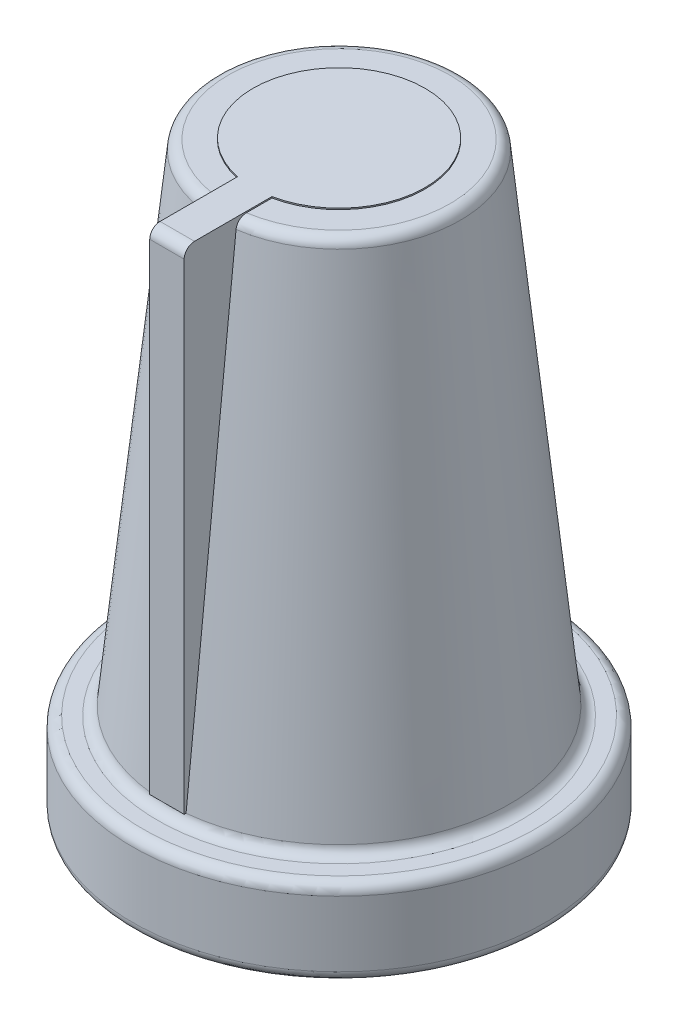
ISO-10303-21;
HEADER;
FILE_DESCRIPTION(('STEP AP214'),'2;1');
FILE_NAME('part.step','',(''),(''),'','','');
FILE_SCHEMA(('AUTOMOTIVE_DESIGN { 1 0 10303 214 1 1 1 1 }'));
ENDSEC;
DATA;
#1=APPLICATION_CONTEXT('core data for automotive mechanical design processes');
#2=APPLICATION_PROTOCOL_DEFINITION('international standard','automotive_design',2000,#1);
#3=PRODUCT_CONTEXT('',#1,'mechanical');
#4=PRODUCT('Part','Part','',(#3));
#5=PRODUCT_RELATED_PRODUCT_CATEGORY('part','',(#4));
#6=PRODUCT_DEFINITION_FORMATION('','',#4);
#7=PRODUCT_DEFINITION_CONTEXT('part definition',#1,'design');
#8=PRODUCT_DEFINITION('design','',#6,#7);
#9=PRODUCT_DEFINITION_SHAPE('','',#8);
#10=(LENGTH_UNIT() NAMED_UNIT(*) SI_UNIT(.MILLI.,.METRE.));
#11=(NAMED_UNIT(*) PLANE_ANGLE_UNIT() SI_UNIT($,.RADIAN.));
#12=(NAMED_UNIT(*) SI_UNIT($,.STERADIAN.) SOLID_ANGLE_UNIT());
#13=UNCERTAINTY_MEASURE_WITH_UNIT(LENGTH_MEASURE(1.E-05),#10,'distance_accuracy_value','');
#14=(GEOMETRIC_REPRESENTATION_CONTEXT(3) GLOBAL_UNCERTAINTY_ASSIGNED_CONTEXT((#13)) GLOBAL_UNIT_ASSIGNED_CONTEXT((#10,
#11,#12)) REPRESENTATION_CONTEXT('',''));
#15=CARTESIAN_POINT('',(0.,0.,0.));
#16=DIRECTION('',(0.,0.,1.));
#17=DIRECTION('',(1.,0.,0.));
#18=AXIS2_PLACEMENT_3D('',#15,#16,#17);
#19=CARTESIAN_POINT('',(0.,10.,0.));
#20=DIRECTION('',(0.,-1.,0.));
#21=DIRECTION('',(0.,0.,-1.));
#22=AXIS2_PLACEMENT_3D('',#19,#20,#21);
#23=PLANE('',#22);
#24=DIRECTION('',(0.,0.,1.));
#25=VECTOR('',#24,1.);
#26=CARTESIAN_POINT('',(-3.,10.,0.));
#27=LINE('',#26,#25);
#28=CARTESIAN_POINT('',(-3.,10.,2.44948974278318));
#29=VERTEX_POINT('',#28);
#30=CARTESIAN_POINT('',(-3.,10.,3.19044893302208));
#31=VERTEX_POINT('',#30);
#32=EDGE_CURVE('E45',#29,#31,#27,.T.);
#33=ORIENTED_EDGE('',*,*,#32,.F.);
#34=CARTESIAN_POINT('',(-2.5,10.,0.));
#35=DIRECTION('',(0.,-1.,0.));
#36=DIRECTION('',(0.,0.,-1.));
#37=AXIS2_PLACEMENT_3D('',#34,#35,#36);
#38=CIRCLE('',#37,2.5);
#39=CARTESIAN_POINT('',(-2.,10.,2.44948974278318));
#40=VERTEX_POINT('',#39);
#41=EDGE_CURVE('E229',#29,#40,#38,.T.);
#42=ORIENTED_EDGE('',*,*,#41,.T.);
#43=DIRECTION('',(0.,0.,-1.));
#44=VECTOR('',#43,1.);
#45=CARTESIAN_POINT('',(-2.,10.,0.));
#46=LINE('',#45,#44);
#47=CARTESIAN_POINT('',(-2.,10.,3.19044893302208));
#48=VERTEX_POINT('',#47);
#49=EDGE_CURVE('E123',#48,#40,#46,.T.);
#50=ORIENTED_EDGE('',*,*,#49,.F.);
#51=CARTESIAN_POINT('',(-2.5,10.,0.));
#52=DIRECTION('',(0.,-1.,0.));
#53=DIRECTION('',(0.,0.,-1.));
#54=AXIS2_PLACEMENT_3D('',#51,#52,#53);
#55=CIRCLE('',#54,3.22939071563379);
#56=EDGE_CURVE('E165',#31,#48,#55,.T.);
#57=ORIENTED_EDGE('',*,*,#56,.F.);
#58=EDGE_LOOP('',(#33,#42,#50,#57));
#59=FACE_BOUND('',#58,.T.);
#60=ADVANCED_FACE('F36',(#59),#23,.F.);
#61=CARTESIAN_POINT('',(-2.5,9.7,0.));
#62=DIRECTION('',(0.,-1.,0.));
#63=DIRECTION('',(0.,0.,-1.));
#64=AXIS2_PLACEMENT_3D('',#61,#62,#63);
#65=TOROIDAL_SURFACE('',#64,3.2293907156338,0.3);
#66=CARTESIAN_POINT('',(-2.,9.80659714473536,2.90627092595592));
#67=CARTESIAN_POINT('',(-2.,9.79107954288905,2.9002863500572));
#68=CARTESIAN_POINT('',(-2.,9.77504808297474,2.89560237405859));
#69=CARTESIAN_POINT('',(-2.,9.74241386718379,2.88898893072874));
#70=CARTESIAN_POINT('',(-2.,9.72581051198507,2.88706244899287));
#71=CARTESIAN_POINT('',(-2.,9.69252055488031,2.88603047368517));
#72=CARTESIAN_POINT('',(-2.,9.67583398345656,2.88692401347683));
#73=CARTESIAN_POINT('',(-2.,9.64285274548175,2.89150241449114));
#74=CARTESIAN_POINT('',(-2.,9.62655799367985,2.89518666274562));
#75=CARTESIAN_POINT('',(-2.,9.59482463577489,2.90522871580636));
#76=CARTESIAN_POINT('',(-2.,9.57938557263475,2.91158507751015));
#77=CARTESIAN_POINT('',(-2.,9.54978074876005,2.926778759478));
#78=CARTESIAN_POINT('',(-2.,9.53561507364576,2.93561624640388));
#79=CARTESIAN_POINT('',(-2.,9.50882792360195,2.95559534741943));
#80=CARTESIAN_POINT('',(-2.,9.49622046827976,2.96675575160609));
#81=CARTESIAN_POINT('',(-2.,9.47302727100841,2.99100940783063));
#82=CARTESIAN_POINT('',(-2.,9.46244166507938,3.00410278980479));
#83=CARTESIAN_POINT('',(-2.,9.44344148390248,3.03203960938277));
#84=CARTESIAN_POINT('',(-2.,9.43505808413229,3.04690425083685));
#85=CARTESIAN_POINT('',(-2.,9.42087264251779,3.07781802599083));
#86=CARTESIAN_POINT('',(-2.,9.41507076947824,3.09386723706917));
#87=CARTESIAN_POINT('',(-2.,9.40614892346205,3.12689460678346));
#88=CARTESIAN_POINT('',(-2.,9.40306077391086,3.14388136831635));
#89=CARTESIAN_POINT('',(-2.,9.399765434898,3.17813240423763));
#90=CARTESIAN_POINT('',(-2.,9.3995583514594,3.19539668881544));
#91=CARTESIAN_POINT('',(-2.,9.40203989339294,3.22979635514038));
#92=CARTESIAN_POINT('',(-2.,9.4047418343585,3.24693077952062));
#93=CARTESIAN_POINT('',(-2.,9.41299399579652,3.28049990997672));
#94=CARTESIAN_POINT('',(-2.,9.41854419166324,3.29693462209599));
#95=CARTESIAN_POINT('',(-2.,9.43232129625537,3.32857287008354));
#96=CARTESIAN_POINT('',(-2.,9.44053874037676,3.34378052529881));
#97=CARTESIAN_POINT('',(-2.,9.459432643321,3.37258326450878));
#98=CARTESIAN_POINT('',(-2.,9.47010899304404,3.38617842000837));
#99=CARTESIAN_POINT('',(-2.,9.49351485433732,3.41123528721718));
#100=CARTESIAN_POINT('',(-2.,9.50622466753077,3.42271539688204));
#101=CARTESIAN_POINT('',(-2.,9.53340897683371,3.44335128650953));
#102=CARTESIAN_POINT('',(-2.,9.54788336869423,3.45250720368397));
#103=CARTESIAN_POINT('',(-2.,9.57802081359236,3.4681333682114));
#104=CARTESIAN_POINT('',(-2.,9.593669647033,3.47463104398561));
#105=CARTESIAN_POINT('',(-2.,9.62584151559273,3.48488289790701));
#106=CARTESIAN_POINT('',(-2.,9.64236450704172,3.48863721296509));
#107=CARTESIAN_POINT('',(-2.,9.67567387985522,3.49326966184609));
#108=CARTESIAN_POINT('',(-2.,9.69245710183501,3.49417053705435));
#109=CARTESIAN_POINT('',(-2.,9.72593532717118,3.49313328349119));
#110=CARTESIAN_POINT('',(-2.,9.74263033266934,3.49119522396557));
#111=CARTESIAN_POINT('',(-2.,9.7754112661128,3.48454766553607));
#112=CARTESIAN_POINT('',(-2.,9.79149872934324,3.47984573061657));
#113=CARTESIAN_POINT('',(-2.,9.82265974772867,3.46781646283782));
#114=CARTESIAN_POINT('',(-2.,9.8377332944407,3.46048910811973));
#115=CARTESIAN_POINT('',(-2.,9.86649561601724,3.44339589312583));
#116=CARTESIAN_POINT('',(-2.,9.88017959494747,3.43362196573282));
#117=CARTESIAN_POINT('',(-2.,9.90572947731311,3.41193303384462));
#118=CARTESIAN_POINT('',(-2.,9.91759531552992,3.4000179525773));
#119=CARTESIAN_POINT('',(-2.,9.93927987615705,3.37428097965713));
#120=CARTESIAN_POINT('',(-2.,9.94908074291233,3.36044404640472));
#121=CARTESIAN_POINT('',(-2.,9.9662487250114,3.33133504911752));
#122=CARTESIAN_POINT('',(-2.,9.97361570249089,3.31606290385005));
#123=CARTESIAN_POINT('',(-2.,9.98578852012221,3.28434459789789));
#124=CARTESIAN_POINT('',(-2.,9.99056650820758,3.26788774738349));
#125=CARTESIAN_POINT('',(-2.,9.99731891533104,3.23440852110048));
#126=CARTESIAN_POINT('',(-2.,9.99929317712394,3.21738611366776));
#127=CARTESIAN_POINT('',(-2.,10.0003947367035,3.18309736472043));
#128=CARTESIAN_POINT('',(-2.,9.99949654231611,3.16583020049259));
#129=CARTESIAN_POINT('',(-2.,9.9948240133196,3.1316897420605));
#130=CARTESIAN_POINT('',(-2.,9.9910496984481,3.11481644515414));
#131=CARTESIAN_POINT('',(-2.,9.98071118401219,3.08189037567392));
#132=CARTESIAN_POINT('',(-2.,9.97413854373954,3.06584025154189));
#133=CARTESIAN_POINT('',(-2.,9.95837684613505,3.03507445613103));
#134=CARTESIAN_POINT('',(-2.,9.94918717612934,3.02035909839979));
#135=CARTESIAN_POINT('',(-2.,9.9284924151483,2.99276469536177));
#136=CARTESIAN_POINT('',(-2.,9.91699808675214,2.97987757311063));
#137=CARTESIAN_POINT('',(-2.,9.89199352423432,2.95625768389604));
#138=CARTESIAN_POINT('',(-2.,9.87848588129159,2.94552218878304));
#139=CARTESIAN_POINT('',(-2.,9.85514884979056,2.93004266787893));
#140=CARTESIAN_POINT('',(-2.,9.84580633992835,2.9245510665485));
#141=CARTESIAN_POINT('',(-2.,9.82658083907848,2.91461293714097));
#142=CARTESIAN_POINT('',(-2.,9.81669785170365,2.91016640207918));
#143=CARTESIAN_POINT('',(-2.,9.80659714473536,2.90627092595592));
#144=B_SPLINE_CURVE_WITH_KNOTS('',3,(#66,#67,#68,#69,#70,#71,#72,#73,#74,#75,#76,#77,#78,#79,
#80,#81,#82,#83,#84,#85,#86,#87,#88,#89,#90,#91,#92,#93,#94,#95,#96,#97,#98,#99,#100,#101,#102,
#103,#104,#105,#106,#107,#108,#109,#110,#111,#112,#113,#114,#115,#116,#117,#118,#119,#120,#121,
#122,#123,#124,#125,#126,#127,#128,#129,#130,#131,#132,#133,#134,#135,#136,#137,#138,#139,#140,
#141,#142,#143),.UNSPECIFIED.,.T.,.F.,(4,2,2,2,2,2,2,2,2,2,2,2,2,2,2,2,2,2,2,2,2,2,2,2,2,2,2,2,
2,2,2,2,2,2,2,2,2,2,4),(0.,0.0498556318695391,0.0997652027243041,0.14965766762013,
0.199539177008407,0.249393781910329,0.299251736440633,0.349529862590244,0.399811370015246,
0.450770395190202,0.501732752061171,0.553285054195704,0.604839253446782,0.656630441015106,
0.708421181172938,0.760030117468943,0.811636764355758,0.862770795133005,0.913901806442036,
0.964491053124979,1.01507777491514,1.06526030209604,1.1154416052715,1.16548621091952,
1.21553123324103,1.26574349493911,1.31595755738157,1.36658945160017,1.41722421330086,
1.46839339735515,1.51956545108728,1.57119289726902,1.62281998915603,1.67460392178552,
1.72639998755232,1.7779595788735,1.82945337591021,1.86190558721202,1.89435758161301),.UNSPECIFIED.);
#145=CARTESIAN_POINT('',(-2.,9.73082278703105,3.49219053996464));
#146=VERTEX_POINT('',#145);
#147=EDGE_CURVE('E142',#146,#48,#144,.T.);
#148=ORIENTED_EDGE('',*,*,#147,.F.);
#149=CARTESIAN_POINT('',(-2.5,9.73082278703105,0.));
#150=DIRECTION('',(0.,-1.,0.));
#151=DIRECTION('',(0.,0.,-1.));
#152=AXIS2_PLACEMENT_3D('',#149,#150,#151);
#153=CIRCLE('',#152,3.52780310780215);
#154=CARTESIAN_POINT('',(-3.,9.73082278703105,3.49219053996464));
#155=VERTEX_POINT('',#154);
#156=EDGE_CURVE('E240',#155,#146,#153,.T.);
#157=ORIENTED_EDGE('',*,*,#156,.F.);
#158=CARTESIAN_POINT('',(-3.,9.80659714473536,2.90627092595592));
#159=CARTESIAN_POINT('',(-3.,9.82233910592254,2.91234369296216));
#160=CARTESIAN_POINT('',(-3.,9.83757528962061,2.9197641034663));
#161=CARTESIAN_POINT('',(-3.,9.8665919492256,2.93707340003797));
#162=CARTESIAN_POINT('',(-3.,9.8803704524328,2.94696557185542));
#163=CARTESIAN_POINT('',(-3.,9.90606353704512,2.96890605100413));
#164=CARTESIAN_POINT('',(-3.,9.91798007319742,2.98095206827678));
#165=CARTESIAN_POINT('',(-3.,9.93964252159488,3.00685216511195));
#166=CARTESIAN_POINT('',(-3.,9.94938894958684,3.02070581382973));
#167=CARTESIAN_POINT('',(-3.,9.96654697818114,3.04997944114713));
#168=CARTESIAN_POINT('',(-3.,9.973933974619,3.06541384078252));
#169=CARTESIAN_POINT('',(-3.,9.98604318243197,3.09729562562512));
#170=CARTESIAN_POINT('',(-3.,9.9907651218682,3.11374311401671));
#171=CARTESIAN_POINT('',(-3.,9.99745399402902,3.14736876078178));
#172=CARTESIAN_POINT('',(-3.,9.99939156144716,3.16455276665542));
#173=CARTESIAN_POINT('',(-3.,10.0003637901154,3.19900304469745));
#174=CARTESIAN_POINT('',(-3.,9.99939837527602,3.21626931901031));
#175=CARTESIAN_POINT('',(-3.,9.99457939984763,3.25044614938137));
#176=CARTESIAN_POINT('',(-3.,9.99071741327966,3.26735551939245));
#177=CARTESIAN_POINT('',(-3.,9.98019549157291,3.30028055448737));
#178=CARTESIAN_POINT('',(-3.,9.97353560984408,3.31629623662451));
#179=CARTESIAN_POINT('',(-3.,9.95763627655503,3.34689153883284));
#180=CARTESIAN_POINT('',(-3.,9.9484097141939,3.36147785428725));
#181=CARTESIAN_POINT('',(-3.,9.92761592659742,3.38887443343399));
#182=CARTESIAN_POINT('',(-3.,9.91604881410048,3.40168478262011));
#183=CARTESIAN_POINT('',(-3.,9.89102266589646,3.42503032748729));
#184=CARTESIAN_POINT('',(-3.,9.87758329479071,3.43558660164077));
#185=CARTESIAN_POINT('',(-3.,9.8491076606696,3.45426491937455));
#186=CARTESIAN_POINT('',(-3.,9.83407149256587,3.46238710752434));
#187=CARTESIAN_POINT('',(-3.,9.80299700441807,3.47587987057707));
#188=CARTESIAN_POINT('',(-3.,9.78697068481448,3.48127808893759));
#189=CARTESIAN_POINT('',(-3.,9.75423592312133,3.48928568272434));
#190=CARTESIAN_POINT('',(-3.,9.73752751220781,3.49189518546532));
#191=CARTESIAN_POINT('',(-3.,9.70402966503821,3.49423790772078));
#192=CARTESIAN_POINT('',(-3.,9.6872416418114,3.49399137693554));
#193=CARTESIAN_POINT('',(-3.,9.65394645872922,3.49067851091755));
#194=CARTESIAN_POINT('',(-3.,9.63743929382066,3.48761222647229));
#195=CARTESIAN_POINT('',(-3.,9.60519881958515,3.47875854586465));
#196=CARTESIAN_POINT('',(-3.,9.58946438437197,3.47297524672809));
#197=CARTESIAN_POINT('',(-3.,9.55918368568942,3.45886057381043));
#198=CARTESIAN_POINT('',(-3.,9.54463743927583,3.45052916346081));
#199=CARTESIAN_POINT('',(-3.,9.51707298846111,3.43151925896952));
#200=CARTESIAN_POINT('',(-3.,9.50406193969162,3.42083039237099));
#201=CARTESIAN_POINT('',(-3.,9.47999914199693,3.39743777694235));
#202=CARTESIAN_POINT('',(-3.,9.46894747445966,3.38473394445697));
#203=CARTESIAN_POINT('',(-3.,9.44900866906952,3.35755071192744));
#204=CARTESIAN_POINT('',(-3.,9.44014200128571,3.34305629921728));
#205=CARTESIAN_POINT('',(-3.,9.42493853306359,3.31279660290074));
#206=CARTESIAN_POINT('',(-3.,9.41860187622881,3.2970312472166));
#207=CARTESIAN_POINT('',(-3.,9.40856909562181,3.26449898683008));
#208=CARTESIAN_POINT('',(-3.,9.40490155563889,3.24772326547568));
#209=CARTESIAN_POINT('',(-3.,9.40041010840627,3.21379527810764));
#210=CARTESIAN_POINT('',(-3.,9.39958634517178,3.19664299306823));
#211=CARTESIAN_POINT('',(-3.,9.40080570655277,3.16230224712349));
#212=CARTESIAN_POINT('',(-3.,9.4028719025548,3.1451146014848));
#213=CARTESIAN_POINT('',(-3.,9.4098552416673,3.11132806172925));
#214=CARTESIAN_POINT('',(-3.,9.41477245813387,3.09472918277289));
#215=CARTESIAN_POINT('',(-3.,9.42733573706,3.06256703011727));
#216=CARTESIAN_POINT('',(-3.,9.4349861448151,3.04700545256113));
#217=CARTESIAN_POINT('',(-3.,9.45280768187299,3.01739888179029));
#218=CARTESIAN_POINT('',(-3.,9.46297875424321,3.00335385433257));
#219=CARTESIAN_POINT('',(-3.,9.48548647135191,2.97728515479003));
#220=CARTESIAN_POINT('',(-3.,9.49780820349624,2.96524861258032));
#221=CARTESIAN_POINT('',(-3.,9.5243200652411,2.94344810448748));
#222=CARTESIAN_POINT('',(-3.,9.53850998905355,2.93368388862676));
#223=CARTESIAN_POINT('',(-3.,9.56815956046341,2.91684107415682));
#224=CARTESIAN_POINT('',(-3.,9.58360036151502,2.90972929872689));
#225=CARTESIAN_POINT('',(-3.,9.61547151706778,2.89823577316051));
#226=CARTESIAN_POINT('',(-3.,9.63190204436552,2.89385450126732));
#227=CARTESIAN_POINT('',(-3.,9.66506239129601,2.88799980563571));
#228=CARTESIAN_POINT('',(-3.,9.68178603298571,2.88649123494713));
#229=CARTESIAN_POINT('',(-3.,9.71523294720304,2.88632494264542));
#230=CARTESIAN_POINT('',(-3.,9.73195619260783,2.88766356133625));
#231=CARTESIAN_POINT('',(-3.,9.75836728426786,2.89204708680595));
#232=CARTESIAN_POINT('',(-3.,9.76821118912431,2.89420305982011));
#233=CARTESIAN_POINT('',(-3.,9.78762914579854,2.89950303605228));
#234=CARTESIAN_POINT('',(-3.,9.79720320026133,2.90264702958228));
#235=CARTESIAN_POINT('',(-3.,9.80659714473536,2.90627092595592));
#236=B_SPLINE_CURVE_WITH_KNOTS('',3,(#158,#159,#160,#161,#162,#163,#164,#165,#166,#167,#168,
#169,#170,#171,#172,#173,#174,#175,#176,#177,#178,#179,#180,#181,#182,#183,#184,#185,#186,#187,
#188,#189,#190,#191,#192,#193,#194,#195,#196,#197,#198,#199,#200,#201,#202,#203,#204,#205,#206,
#207,#208,#209,#210,#211,#212,#213,#214,#215,#216,#217,#218,#219,#220,#221,#222,#223,#224,#225,
#226,#227,#228,#229,#230,#231,#232,#233,#234,#235),.UNSPECIFIED.,.T.,.F.,(4,2,2,2,2,2,2,2,2,2,2,
2,2,2,2,2,2,2,2,2,2,2,2,2,2,2,2,2,2,2,2,2,2,2,2,2,2,2,4),(0.,0.0505807108587324,
0.101229020501536,0.151823795547677,0.202406533400379,0.253500719803999,0.304600118848522,
0.356234578072008,0.407870390687967,0.459656994653379,0.511442610091828,0.562972725658993,
0.614500359740451,0.665522710531416,0.716542030312917,0.767032622156604,0.817520908827177,
0.867651446450065,0.917781081173392,0.967835366132328,1.01789036946525,1.06817016410037,
1.11845204674679,1.16918846827102,1.21992776918733,1.27120275160075,1.32248033065579,
1.37416961810945,1.42586023557571,1.47763340046989,1.52940539610438,1.5808317187318,
1.63225238129552,1.6830063945854,1.73376929486168,1.78390702716896,1.83398035281364,
1.86416446028389,1.89434827179339),.UNSPECIFIED.);
#237=EDGE_CURVE('E136',#31,#155,#236,.T.);
#238=ORIENTED_EDGE('',*,*,#237,.F.);
#239=ORIENTED_EDGE('',*,*,#56,.T.);
#240=EDGE_LOOP('',(#148,#157,#238,#239));
#241=FACE_BOUND('',#240,.T.);
#242=ADVANCED_FACE('F38',(#241),#65,.T.);
#243=CARTESIAN_POINT('',(-2.5,-7.,0.));
#244=DIRECTION('',(0.,-1.,0.));
#245=DIRECTION('',(0.,0.,-1.));
#246=AXIS2_PLACEMENT_3D('',#243,#244,#245);
#247=CYLINDRICAL_SURFACE('',#246,3.);
#248=CARTESIAN_POINT('',(-2.5,-5.,0.));
#249=DIRECTION('',(0.,-1.,0.));
#250=DIRECTION('',(0.,0.,-1.));
#251=AXIS2_PLACEMENT_3D('',#248,#249,#250);
#252=CIRCLE('',#251,3.);
#253=CARTESIAN_POINT('',(-2.5,-5.,-3.));
#254=VERTEX_POINT('',#253);
#255=EDGE_CURVE('E270',#254,#254,#252,.T.);
#256=ORIENTED_EDGE('',*,*,#255,.T.);
#257=EDGE_LOOP('',(#256));
#258=FACE_BOUND('',#257,.T.);
#259=CARTESIAN_POINT('',(-2.5,8.93754676912061,0.));
#260=DIRECTION('',(0.,1.,0.));
#261=DIRECTION('',(0.,0.,1.));
#262=AXIS2_PLACEMENT_3D('',#259,#260,#261);
#263=CIRCLE('',#262,3.);
#264=CARTESIAN_POINT('',(-2.5,8.93754676912061,3.));
#265=VERTEX_POINT('',#264);
#266=EDGE_CURVE('E116',#265,#265,#263,.F.);
#267=ORIENTED_EDGE('',*,*,#266,.F.);
#268=EDGE_LOOP('',(#267));
#269=FACE_BOUND('',#268,.T.);
#270=ADVANCED_FACE('F176',(#258,#269),#247,.F.);
#271=CARTESIAN_POINT('',(-2.5,9.73082278703105,0.));
#272=DIRECTION('',(0.,-1.,0.));
#273=DIRECTION('',(0.,0.,-1.));
#274=AXIS2_PLACEMENT_3D('',#271,#272,#273);
#275=CONICAL_SURFACE('',#274,3.52780310780215,0.102924246839153);
#276=CARTESIAN_POINT('',(-2.,-10.99927987243,5.6469067110615));
#277=CARTESIAN_POINT('',(-2.,-9.56252525721492,5.49792288587475));
#278=CARTESIAN_POINT('',(-2.,-8.12577496863599,5.34889730224219));
#279=CARTESIAN_POINT('',(-2.,-5.25228594525633,5.05072897545301));
#280=CARTESIAN_POINT('',(-2.,-3.81554721046065,4.90158623224771));
#281=CARTESIAN_POINT('',(-2.,-1.66045081683063,4.67775910576684));
#282=CARTESIAN_POINT('',(-2.,-0.942087289629983,4.60313122686343));
#283=CARTESIAN_POINT('',(-2.,0.494635119735027,4.45383150926873));
#284=CARTESIAN_POINT('',(-2.,1.21299400189987,4.37915967058211));
#285=CARTESIAN_POINT('',(-2.,2.64970609301175,4.22976499499284));
#286=CARTESIAN_POINT('',(-2.,3.3680593019615,4.15504215811625));
#287=CARTESIAN_POINT('',(-2.,4.80475974427069,4.00553642211661));
#288=CARTESIAN_POINT('',(-2.,5.52310697762777,3.93075352297087));
#289=CARTESIAN_POINT('',(-2.,7.45244702284827,3.72980531440301));
#290=CARTESIAN_POINT('',(-2.,8.66343305356435,3.60357488545938));
#291=CARTESIAN_POINT('',(-2.,11.0853762814993,3.35084149790562));
#292=CARTESIAN_POINT('',(-2.,12.2963334787275,3.22433853938515));
#293=CARTESIAN_POINT('',(-2.,14.7182042954742,2.97094766086778));
#294=CARTESIAN_POINT('',(-2.,15.9291179151015,2.84405974191225));
#295=CARTESIAN_POINT('',(-2.,18.3508875267245,2.58971864925683));
#296=CARTESIAN_POINT('',(-2.,19.5617435186389,2.46226547478316));
#297=CARTESIAN_POINT('',(-2.,21.3779628171724,2.27041266066078));
#298=CARTESIAN_POINT('',(-2.,21.983361629988,2.20634921088898));
#299=CARTESIAN_POINT('',(-2.,23.1941279553443,2.0779291177061));
#300=CARTESIAN_POINT('',(-2.,23.7994954678962,2.01357247439909));
#301=CARTESIAN_POINT('',(-2.,25.0101865171343,1.88447183662267));
#302=CARTESIAN_POINT('',(-2.,25.6155100540021,1.81972784385725));
#303=CARTESIAN_POINT('',(-2.,26.8261011101762,1.68971030686718));
#304=CARTESIAN_POINT('',(-2.,27.431368629409,1.6244367619588));
#305=CARTESIAN_POINT('',(-2.,28.641831677434,1.49313466477986));
#306=CARTESIAN_POINT('',(-2.,29.2470272049124,1.42710610038819));
#307=CARTESIAN_POINT('',(-2.,30.4572933640125,1.29392935855918));
#308=CARTESIAN_POINT('',(-2.,31.0623639960713,1.22678118510926));
#309=CARTESIAN_POINT('',(-2.,31.9698218860763,1.12469306018614));
#310=CARTESIAN_POINT('',(-2.,32.2722858485477,1.09043573194263));
#311=CARTESIAN_POINT('',(-2.,32.8771433283779,1.02130913357055));
#312=CARTESIAN_POINT('',(-2.,33.1795368458636,0.98643986455277));
#313=CARTESIAN_POINT('',(-2.,33.7842329238386,0.915884559627593));
#314=CARTESIAN_POINT('',(-2.,34.0865354831453,0.880198513528375));
#315=CARTESIAN_POINT('',(-2.,34.6909956849935,0.807605883922298));
#316=CARTESIAN_POINT('',(-2.,34.993153326606,0.770699292694845));
#317=CARTESIAN_POINT('',(-2.,35.2952115049679,0.732980555560951));
#318=B_SPLINE_CURVE_WITH_KNOTS('',3,(#276,#277,#278,#279,#280,#281,#282,#283,#284,#285,#286,
#287,#288,#289,#290,#291,#292,#293,#294,#295,#296,#297,#298,#299,#300,#301,#302,#303,#304,#305,
#306,#307,#308,#309,#310,#311,#312,#313,#314,#315,#316,#317),.UNSPECIFIED.,.F.,.F.,(4,2,2,2,2,2,
2,2,2,2,2,2,2,2,2,2,2,2,2,2,4),(0.,4.33337513764963,8.66675207693888,10.8334406315464,
13.0001289564208,15.1668161757662,17.3335042144824,20.9861459204809,24.6387864247402,
28.2914170567066,31.9440526902321,33.7703895831898,35.5967258279895,37.4230540444761,
39.2493846193978,41.0757445556036,42.9020979887159,43.8152908648989,44.7284820836314,
45.6416847034723,46.5548931009075),.UNSPECIFIED.);
#319=CARTESIAN_POINT('',(-2.,-4.23082278703105,4.94467534192744));
#320=VERTEX_POINT('',#319);
#321=EDGE_CURVE('E164',#320,#146,#318,.T.);
#322=ORIENTED_EDGE('',*,*,#321,.F.);
#323=CARTESIAN_POINT('',(-2.5,-4.23082278703105,0.));
#324=DIRECTION('',(0.,-1.,0.));
#325=DIRECTION('',(0.,0.,-1.));
#326=AXIS2_PLACEMENT_3D('',#323,#324,#325);
#327=CIRCLE('',#326,4.96989076711604);
#328=CARTESIAN_POINT('',(-3.,-4.23082278703105,4.94467534192744));
#329=VERTEX_POINT('',#328);
#330=EDGE_CURVE('E241',#329,#320,#327,.T.);
#331=ORIENTED_EDGE('',*,*,#330,.F.);
#332=CARTESIAN_POINT('',(-3.,-10.99927987243,5.6469067110615));
#333=CARTESIAN_POINT('',(-3.,-9.56252525721492,5.49792288587475));
#334=CARTESIAN_POINT('',(-3.,-8.12577496863599,5.34889730224219));
#335=CARTESIAN_POINT('',(-3.,-5.25228594525633,5.05072897545301));
#336=CARTESIAN_POINT('',(-3.,-3.81554721046065,4.90158623224771));
#337=CARTESIAN_POINT('',(-3.,-1.66045081683063,4.67775910576684));
#338=CARTESIAN_POINT('',(-3.,-0.942087289629983,4.60313122686343));
#339=CARTESIAN_POINT('',(-3.,0.494635119735027,4.45383150926873));
#340=CARTESIAN_POINT('',(-3.,1.21299400189987,4.37915967058211));
#341=CARTESIAN_POINT('',(-3.,2.64970609301175,4.22976499499284));
#342=CARTESIAN_POINT('',(-3.,3.3680593019615,4.15504215811625));
#343=CARTESIAN_POINT('',(-3.,4.80475974427069,4.00553642211661));
#344=CARTESIAN_POINT('',(-3.,5.52310697762777,3.93075352297087));
#345=CARTESIAN_POINT('',(-3.,7.45244702284827,3.72980531440301));
#346=CARTESIAN_POINT('',(-3.,8.66343305356435,3.60357488545938));
#347=CARTESIAN_POINT('',(-3.,11.0853762814993,3.35084149790562));
#348=CARTESIAN_POINT('',(-3.,12.2963334787275,3.22433853938516));
#349=CARTESIAN_POINT('',(-3.,14.7182042954742,2.97094766086778));
#350=CARTESIAN_POINT('',(-3.,15.9291179151015,2.84405974191225));
#351=CARTESIAN_POINT('',(-3.,18.3508875267245,2.58971864925683));
#352=CARTESIAN_POINT('',(-3.,19.5617435186389,2.46226547478316));
#353=CARTESIAN_POINT('',(-3.,21.3779628171724,2.27041266066078));
#354=CARTESIAN_POINT('',(-3.,21.983361629988,2.20634921088898));
#355=CARTESIAN_POINT('',(-3.,23.1941279553443,2.07792911770611));
#356=CARTESIAN_POINT('',(-3.,23.7994954678962,2.01357247439909));
#357=CARTESIAN_POINT('',(-3.,25.0101865171343,1.88447183662267));
#358=CARTESIAN_POINT('',(-3.,25.6155100540021,1.81972784385725));
#359=CARTESIAN_POINT('',(-3.,26.8261011101762,1.68971030686718));
#360=CARTESIAN_POINT('',(-3.,27.431368629409,1.6244367619588));
#361=CARTESIAN_POINT('',(-3.,28.641831677434,1.49313466477986));
#362=CARTESIAN_POINT('',(-3.,29.2470272049124,1.42710610038819));
#363=CARTESIAN_POINT('',(-3.,30.4572933640125,1.29392935855918));
#364=CARTESIAN_POINT('',(-3.,31.0623639960713,1.22678118510926));
#365=CARTESIAN_POINT('',(-3.,31.9698218860763,1.12469306018614));
#366=CARTESIAN_POINT('',(-3.,32.2722858485477,1.09043573194263));
#367=CARTESIAN_POINT('',(-3.,32.8771433283779,1.02130913357055));
#368=CARTESIAN_POINT('',(-3.,33.1795368458636,0.98643986455277));
#369=CARTESIAN_POINT('',(-3.,33.7842329238386,0.915884559627593));
#370=CARTESIAN_POINT('',(-3.,34.0865354831453,0.880198513528376));
#371=CARTESIAN_POINT('',(-3.,34.6909956849935,0.807605883922299));
#372=CARTESIAN_POINT('',(-3.,34.993153326606,0.770699292694847));
#373=CARTESIAN_POINT('',(-3.,35.2952115049679,0.732980555560951));
#374=B_SPLINE_CURVE_WITH_KNOTS('',3,(#332,#333,#334,#335,#336,#337,#338,#339,#340,#341,#342,
#343,#344,#345,#346,#347,#348,#349,#350,#351,#352,#353,#354,#355,#356,#357,#358,#359,#360,#361,
#362,#363,#364,#365,#366,#367,#368,#369,#370,#371,#372,#373),.UNSPECIFIED.,.F.,.F.,(4,2,2,2,2,2,
2,2,2,2,2,2,2,2,2,2,2,2,2,2,4),(0.,4.33337513764963,8.66675207693888,10.8334406315464,
13.0001289564208,15.1668161757662,17.3335042144824,20.9861459204809,24.6387864247402,
28.2914170567066,31.9440526902321,33.7703895831898,35.5967258279895,37.4230540444761,
39.2493846193978,41.0757445556036,42.9020979887159,43.8152908648989,44.7284820836314,
45.6416847034723,46.5548931009076),.UNSPECIFIED.);
#375=EDGE_CURVE('E59',#155,#329,#374,.F.);
#376=ORIENTED_EDGE('',*,*,#375,.F.);
#377=ORIENTED_EDGE('',*,*,#156,.T.);
#378=EDGE_LOOP('',(#322,#331,#376,#377));
#379=FACE_BOUND('',#378,.T.);
#380=ADVANCED_FACE('F171',(#379),#275,.T.);
#381=CARTESIAN_POINT('',(0.,-5.,0.));
#382=DIRECTION('',(0.,1.,0.));
#383=DIRECTION('',(0.,0.,1.));
#384=AXIS2_PLACEMENT_3D('',#381,#382,#383);
#385=PLANE('',#384);
#386=ORIENTED_EDGE('',*,*,#255,.F.);
#387=EDGE_LOOP('',(#386));
#388=FACE_BOUND('',#387,.T.);
#389=CARTESIAN_POINT('',(-2.5,-5.,0.));
#390=DIRECTION('',(0.,-1.,0.));
#391=DIRECTION('',(0.,0.,-1.));
#392=AXIS2_PLACEMENT_3D('',#389,#390,#391);
#393=CIRCLE('',#392,5.2);
#394=CARTESIAN_POINT('',(-2.5,-5.,-5.2));
#395=VERTEX_POINT('',#394);
#396=EDGE_CURVE('E267',#395,#395,#393,.T.);
#397=ORIENTED_EDGE('',*,*,#396,.T.);
#398=EDGE_LOOP('',(#397));
#399=FACE_BOUND('',#398,.T.);
#400=ADVANCED_FACE('F175',(#388,#399),#385,.F.);
#401=CARTESIAN_POINT('',(-2.5,-5.3,0.));
#402=DIRECTION('',(0.,-1.,0.));
#403=DIRECTION('',(0.,0.,-1.));
#404=AXIS2_PLACEMENT_3D('',#401,#402,#403);
#405=TOROIDAL_SURFACE('',#404,5.2,0.3);
#406=ORIENTED_EDGE('',*,*,#396,.F.);
#407=EDGE_LOOP('',(#406));
#408=FACE_BOUND('',#407,.T.);
#409=CARTESIAN_POINT('',(-2.5,-5.3,0.));
#410=DIRECTION('',(0.,-1.,0.));
#411=DIRECTION('',(0.,0.,-1.));
#412=AXIS2_PLACEMENT_3D('',#409,#410,#411);
#413=CIRCLE('',#412,5.5);
#414=CARTESIAN_POINT('',(-2.5,-5.3,-5.5));
#415=VERTEX_POINT('',#414);
#416=EDGE_CURVE('E264',#415,#415,#413,.T.);
#417=ORIENTED_EDGE('',*,*,#416,.T.);
#418=EDGE_LOOP('',(#417));
#419=FACE_BOUND('',#418,.T.);
#420=ADVANCED_FACE('F206',(#408,#419),#405,.F.);
#421=CARTESIAN_POINT('',(-2.5,-7.,0.));
#422=DIRECTION('',(0.,-1.,0.));
#423=DIRECTION('',(0.,0.,-1.));
#424=AXIS2_PLACEMENT_3D('',#421,#422,#423);
#425=CYLINDRICAL_SURFACE('',#424,5.5);
#426=ORIENTED_EDGE('',*,*,#416,.F.);
#427=EDGE_LOOP('',(#426));
#428=FACE_BOUND('',#427,.T.);
#429=CARTESIAN_POINT('',(-2.5,-7.,0.));
#430=DIRECTION('',(0.,-1.,0.));
#431=DIRECTION('',(0.,0.,-1.));
#432=AXIS2_PLACEMENT_3D('',#429,#430,#431);
#433=CIRCLE('',#432,5.5);
#434=CARTESIAN_POINT('',(-2.5,-7.,-5.5));
#435=VERTEX_POINT('',#434);
#436=EDGE_CURVE('E261',#435,#435,#433,.T.);
#437=ORIENTED_EDGE('',*,*,#436,.T.);
#438=EDGE_LOOP('',(#437));
#439=FACE_BOUND('',#438,.T.);
#440=ADVANCED_FACE('F202',(#428,#439),#425,.F.);
#441=CARTESIAN_POINT('',(0.,-7.,0.));
#442=DIRECTION('',(0.,1.,0.));
#443=DIRECTION('',(0.,0.,1.));
#444=AXIS2_PLACEMENT_3D('',#441,#442,#443);
#445=PLANE('',#444);
#446=ORIENTED_EDGE('',*,*,#436,.F.);
#447=EDGE_LOOP('',(#446));
#448=FACE_BOUND('',#447,.T.);
#449=CARTESIAN_POINT('',(-2.5,-7.,0.));
#450=DIRECTION('',(0.,-1.,0.));
#451=DIRECTION('',(0.,0.,-1.));
#452=AXIS2_PLACEMENT_3D('',#449,#450,#451);
#453=CIRCLE('',#452,5.7);
#454=CARTESIAN_POINT('',(-2.5,-7.,-5.7));
#455=VERTEX_POINT('',#454);
#456=EDGE_CURVE('E258',#455,#455,#453,.T.);
#457=ORIENTED_EDGE('',*,*,#456,.T.);
#458=EDGE_LOOP('',(#457));
#459=FACE_BOUND('',#458,.T.);
#460=ADVANCED_FACE('F198',(#448,#459),#445,.F.);
#461=CARTESIAN_POINT('',(-2.5,-6.7,0.));
#462=DIRECTION('',(0.,-1.,0.));
#463=DIRECTION('',(0.,0.,-1.));
#464=AXIS2_PLACEMENT_3D('',#461,#462,#463);
#465=TOROIDAL_SURFACE('',#464,5.7,0.3);
#466=ORIENTED_EDGE('',*,*,#456,.F.);
#467=EDGE_LOOP('',(#466));
#468=FACE_BOUND('',#467,.T.);
#469=CARTESIAN_POINT('',(-2.5,-6.7,0.));
#470=DIRECTION('',(0.,-1.,0.));
#471=DIRECTION('',(0.,0.,-1.));
#472=AXIS2_PLACEMENT_3D('',#469,#470,#471);
#473=CIRCLE('',#472,6.);
#474=CARTESIAN_POINT('',(-2.5,-6.7,-6.));
#475=VERTEX_POINT('',#474);
#476=EDGE_CURVE('E255',#475,#475,#473,.T.);
#477=ORIENTED_EDGE('',*,*,#476,.T.);
#478=EDGE_LOOP('',(#477));
#479=FACE_BOUND('',#478,.T.);
#480=ADVANCED_FACE('F194',(#468,#479),#465,.T.);
#481=CARTESIAN_POINT('',(-2.5,-7.,0.));
#482=DIRECTION('',(0.,-1.,0.));
#483=DIRECTION('',(0.,0.,-1.));
#484=AXIS2_PLACEMENT_3D('',#481,#482,#483);
#485=CYLINDRICAL_SURFACE('',#484,6.);
#486=ORIENTED_EDGE('',*,*,#476,.F.);
#487=EDGE_LOOP('',(#486));
#488=FACE_BOUND('',#487,.T.);
#489=CARTESIAN_POINT('',(-2.5,-4.8,0.));
#490=DIRECTION('',(0.,-1.,0.));
#491=DIRECTION('',(0.,0.,-1.));
#492=AXIS2_PLACEMENT_3D('',#489,#490,#491);
#493=CIRCLE('',#492,6.);
#494=CARTESIAN_POINT('',(-2.5,-4.8,-6.));
#495=VERTEX_POINT('',#494);
#496=EDGE_CURVE('E252',#495,#495,#493,.T.);
#497=ORIENTED_EDGE('',*,*,#496,.T.);
#498=EDGE_LOOP('',(#497));
#499=FACE_BOUND('',#498,.T.);
#500=ADVANCED_FACE('F190',(#488,#499),#485,.T.);
#501=CARTESIAN_POINT('',(-2.5,-4.8,0.));
#502=DIRECTION('',(0.,-1.,0.));
#503=DIRECTION('',(0.,0.,-1.));
#504=AXIS2_PLACEMENT_3D('',#501,#502,#503);
#505=TOROIDAL_SURFACE('',#504,5.7,0.3);
#506=ORIENTED_EDGE('',*,*,#496,.F.);
#507=EDGE_LOOP('',(#506));
#508=FACE_BOUND('',#507,.T.);
#509=CARTESIAN_POINT('',(-2.5,-4.5,0.));
#510=DIRECTION('',(0.,-1.,0.));
#511=DIRECTION('',(0.,0.,-1.));
#512=AXIS2_PLACEMENT_3D('',#509,#510,#511);
#513=CIRCLE('',#512,5.7);
#514=CARTESIAN_POINT('',(-2.5,-4.5,-5.7));
#515=VERTEX_POINT('',#514);
#516=EDGE_CURVE('E249',#515,#515,#513,.T.);
#517=ORIENTED_EDGE('',*,*,#516,.T.);
#518=EDGE_LOOP('',(#517));
#519=FACE_BOUND('',#518,.T.);
#520=ADVANCED_FACE('F186',(#508,#519),#505,.T.);
#521=CARTESIAN_POINT('',(0.,-4.5,0.));
#522=DIRECTION('',(0.,-1.,0.));
#523=DIRECTION('',(0.,0.,-1.));
#524=AXIS2_PLACEMENT_3D('',#521,#522,#523);
#525=PLANE('',#524);
#526=ORIENTED_EDGE('',*,*,#516,.F.);
#527=EDGE_LOOP('',(#526));
#528=FACE_BOUND('',#527,.T.);
#529=CARTESIAN_POINT('',(-2.5,-4.5,0.));
#530=DIRECTION('',(0.,-1.,0.));
#531=DIRECTION('',(0.,0.,-1.));
#532=AXIS2_PLACEMENT_3D('',#529,#530,#531);
#533=CIRCLE('',#532,5.26830315928439);
#534=CARTESIAN_POINT('',(-2.5,-4.5,-5.26830315928439));
#535=VERTEX_POINT('',#534);
#536=EDGE_CURVE('E246',#535,#535,#533,.T.);
#537=ORIENTED_EDGE('',*,*,#536,.T.);
#538=EDGE_LOOP('',(#537));
#539=FACE_BOUND('',#538,.T.);
#540=ADVANCED_FACE('F182',(#528,#539),#525,.F.);
#541=CARTESIAN_POINT('',(-2.5,-4.2,0.));
#542=DIRECTION('',(0.,-1.,0.));
#543=DIRECTION('',(0.,0.,-1.));
#544=AXIS2_PLACEMENT_3D('',#541,#542,#543);
#545=TOROIDAL_SURFACE('',#544,5.26830315928439,0.3);
#546=ORIENTED_EDGE('',*,*,#536,.F.);
#547=EDGE_LOOP('',(#546));
#548=FACE_BOUND('',#547,.T.);
#549=EDGE_CURVE('E242',#320,#329,#327,.T.);
#550=ORIENTED_EDGE('',*,*,#549,.T.);
#551=ORIENTED_EDGE('',*,*,#330,.T.);
#552=EDGE_LOOP('',(#550,#551));
#553=FACE_BOUND('',#552,.T.);
#554=ADVANCED_FACE('F178',(#548,#553),#545,.F.);
#555=CARTESIAN_POINT('',(0.,0.,5.));
#556=DIRECTION('',(0.,0.,-1.));
#557=DIRECTION('',(-1.,0.,0.));
#558=AXIS2_PLACEMENT_3D('',#555,#556,#557);
#559=PLANE('',#558);
#560=DIRECTION('',(0.,1.,0.));
#561=VECTOR('',#560,1.);
#562=CARTESIAN_POINT('',(-2.,-4.23082278703105,5.));
#563=LINE('',#562,#561);
#564=CARTESIAN_POINT('',(-2.,-4.23082278703105,5.));
#565=VERTEX_POINT('',#564);
#566=CARTESIAN_POINT('',(-2.,9.73754676912061,5.));
#567=VERTEX_POINT('',#566);
#568=EDGE_CURVE('E113',#565,#567,#563,.T.);
#569=ORIENTED_EDGE('',*,*,#568,.T.);
#570=DIRECTION('',(1.,0.,0.));
#571=VECTOR('',#570,1.);
#572=CARTESIAN_POINT('',(-12.6,9.73754676912061,5.));
#573=LINE('',#572,#571);
#574=CARTESIAN_POINT('',(-3.,9.73754676912061,5.));
#575=VERTEX_POINT('',#574);
#576=EDGE_CURVE('E100',#575,#567,#573,.T.);
#577=ORIENTED_EDGE('',*,*,#576,.F.);
#578=DIRECTION('',(0.,-1.,0.));
#579=VECTOR('',#578,1.);
#580=CARTESIAN_POINT('',(-3.,-4.23082278703105,5.));
#581=LINE('',#580,#579);
#582=CARTESIAN_POINT('',(-3.,-4.23082278703105,5.));
#583=VERTEX_POINT('',#582);
#584=EDGE_CURVE('E122',#575,#583,#581,.T.);
#585=ORIENTED_EDGE('',*,*,#584,.T.);
#586=DIRECTION('',(1.,0.,0.));
#587=VECTOR('',#586,1.);
#588=CARTESIAN_POINT('',(-3.,-4.23082278703105,5.));
#589=LINE('',#588,#587);
#590=EDGE_CURVE('E120',#583,#565,#589,.T.);
#591=ORIENTED_EDGE('',*,*,#590,.T.);
#592=EDGE_LOOP('',(#569,#577,#585,#591));
#593=FACE_BOUND('',#592,.T.);
#594=ADVANCED_FACE('F118',(#593),#559,.F.);
#595=CARTESIAN_POINT('',(-3.,-4.23082278703105,5.));
#596=DIRECTION('',(0.,1.,0.));
#597=DIRECTION('',(0.,0.,1.));
#598=AXIS2_PLACEMENT_3D('',#595,#596,#597);
#599=PLANE('',#598);
#600=DIRECTION('',(0.,0.,-1.));
#601=VECTOR('',#600,1.);
#602=CARTESIAN_POINT('',(-3.,-4.23082278703105,5.));
#603=LINE('',#602,#601);
#604=EDGE_CURVE('E134',#583,#329,#603,.T.);
#605=ORIENTED_EDGE('',*,*,#604,.T.);
#606=ORIENTED_EDGE('',*,*,#549,.F.);
#607=DIRECTION('',(0.,0.,-1.));
#608=VECTOR('',#607,1.);
#609=CARTESIAN_POINT('',(-2.,-4.23082278703105,5.));
#610=LINE('',#609,#608);
#611=EDGE_CURVE('E132',#565,#320,#610,.T.);
#612=ORIENTED_EDGE('',*,*,#611,.F.);
#613=ORIENTED_EDGE('',*,*,#590,.F.);
#614=EDGE_LOOP('',(#605,#606,#612,#613));
#615=FACE_BOUND('',#614,.T.);
#616=ADVANCED_FACE('F152',(#615),#599,.F.);
#617=CARTESIAN_POINT('',(-3.,-4.23082278703105,5.));
#618=DIRECTION('',(1.,0.,0.));
#619=DIRECTION('',(0.,0.,-1.));
#620=AXIS2_PLACEMENT_3D('',#617,#618,#619);
#621=PLANE('',#620);
#622=ORIENTED_EDGE('',*,*,#584,.F.);
#623=CARTESIAN_POINT('',(-3.,9.73754676912061,4.7));
#624=DIRECTION('',(1.,0.,0.));
#625=DIRECTION('',(0.,0.,-1.));
#626=AXIS2_PLACEMENT_3D('',#623,#624,#625);
#627=CIRCLE('',#626,0.3);
#628=CARTESIAN_POINT('',(-3.,10.0375467691206,4.7));
#629=VERTEX_POINT('',#628);
#630=EDGE_CURVE('E103',#575,#629,#627,.F.);
#631=ORIENTED_EDGE('',*,*,#630,.T.);
#632=DIRECTION('',(0.,0.,1.));
#633=VECTOR('',#632,1.);
#634=CARTESIAN_POINT('',(-3.,10.0375467691206,4.94467534192744));
#635=LINE('',#634,#633);
#636=CARTESIAN_POINT('',(-3.,10.0375467691206,2.44948974278318));
#637=VERTEX_POINT('',#636);
#638=EDGE_CURVE('E294',#637,#629,#635,.T.);
#639=ORIENTED_EDGE('',*,*,#638,.F.);
#640=DIRECTION('',(0.,-1.,0.));
#641=VECTOR('',#640,1.);
#642=CARTESIAN_POINT('',(-3.,10.0375467691206,2.44948974278318));
#643=LINE('',#642,#641);
#644=EDGE_CURVE('E305',#637,#29,#643,.T.);
#645=ORIENTED_EDGE('',*,*,#644,.T.);
#646=ORIENTED_EDGE('',*,*,#32,.T.);
#647=ORIENTED_EDGE('',*,*,#237,.T.);
#648=ORIENTED_EDGE('',*,*,#375,.T.);
#649=ORIENTED_EDGE('',*,*,#604,.F.);
#650=EDGE_LOOP('',(#622,#631,#639,#645,#646,#647,#648,#649));
#651=FACE_BOUND('',#650,.T.);
#652=ADVANCED_FACE('F148',(#651),#621,.F.);
#653=CARTESIAN_POINT('',(-2.,-4.23082278703105,5.));
#654=DIRECTION('',(-1.,0.,0.));
#655=DIRECTION('',(0.,-1.,0.));
#656=AXIS2_PLACEMENT_3D('',#653,#654,#655);
#657=PLANE('',#656);
#658=DIRECTION('',(0.,0.,-1.));
#659=VECTOR('',#658,1.);
#660=CARTESIAN_POINT('',(-2.,10.0375467691206,5.));
#661=LINE('',#660,#659);
#662=CARTESIAN_POINT('',(-2.,10.0375467691206,4.7));
#663=VERTEX_POINT('',#662);
#664=CARTESIAN_POINT('',(-2.,10.0375467691206,2.44948974278318));
#665=VERTEX_POINT('',#664);
#666=EDGE_CURVE('E115',#663,#665,#661,.T.);
#667=ORIENTED_EDGE('',*,*,#666,.F.);
#668=CARTESIAN_POINT('',(-2.,9.73754676912061,4.7));
#669=DIRECTION('',(-1.,0.,0.));
#670=DIRECTION('',(0.,-1.,0.));
#671=AXIS2_PLACEMENT_3D('',#668,#669,#670);
#672=CIRCLE('',#671,0.3);
#673=EDGE_CURVE('E51',#567,#663,#672,.T.);
#674=ORIENTED_EDGE('',*,*,#673,.F.);
#675=ORIENTED_EDGE('',*,*,#568,.F.);
#676=ORIENTED_EDGE('',*,*,#611,.T.);
#677=ORIENTED_EDGE('',*,*,#321,.T.);
#678=ORIENTED_EDGE('',*,*,#147,.T.);
#679=ORIENTED_EDGE('',*,*,#49,.T.);
#680=DIRECTION('',(0.,-1.,0.));
#681=VECTOR('',#680,1.);
#682=CARTESIAN_POINT('',(-2.,10.0375467691206,2.44948974278318));
#683=LINE('',#682,#681);
#684=EDGE_CURVE('E127',#665,#40,#683,.T.);
#685=ORIENTED_EDGE('',*,*,#684,.F.);
#686=EDGE_LOOP('',(#667,#674,#675,#676,#677,#678,#679,#685));
#687=FACE_BOUND('',#686,.T.);
#688=ADVANCED_FACE('F111',(#687),#657,.F.);
#689=CARTESIAN_POINT('',(-2.5,10.0375467691206,0.));
#690=DIRECTION('',(0.,-1.,0.));
#691=DIRECTION('',(0.,0.,-1.));
#692=AXIS2_PLACEMENT_3D('',#689,#690,#691);
#693=CYLINDRICAL_SURFACE('',#692,2.5);
#694=ORIENTED_EDGE('',*,*,#684,.T.);
#695=ORIENTED_EDGE('',*,*,#41,.F.);
#696=ORIENTED_EDGE('',*,*,#644,.F.);
#697=CARTESIAN_POINT('',(-2.5,10.0375467691206,0.));
#698=DIRECTION('',(0.,1.,0.));
#699=DIRECTION('',(0.,0.,1.));
#700=AXIS2_PLACEMENT_3D('',#697,#698,#699);
#701=CIRCLE('',#700,2.5);
#702=EDGE_CURVE('E299',#665,#637,#701,.T.);
#703=ORIENTED_EDGE('',*,*,#702,.F.);
#704=EDGE_LOOP('',(#694,#695,#696,#703));
#705=FACE_BOUND('',#704,.T.);
#706=ADVANCED_FACE('F307',(#705),#693,.T.);
#707=CARTESIAN_POINT('',(-2.5,10.0375467691206,0.));
#708=DIRECTION('',(0.,1.,0.));
#709=DIRECTION('',(0.,0.,1.));
#710=AXIS2_PLACEMENT_3D('',#707,#708,#709);
#711=PLANE('',#710);
#712=DIRECTION('',(1.,0.,0.));
#713=VECTOR('',#712,1.);
#714=CARTESIAN_POINT('',(-12.6,10.0375467691206,4.7));
#715=LINE('',#714,#713);
#716=EDGE_CURVE('E11',#663,#629,#715,.F.);
#717=ORIENTED_EDGE('',*,*,#716,.F.);
#718=ORIENTED_EDGE('',*,*,#666,.T.);
#719=ORIENTED_EDGE('',*,*,#702,.T.);
#720=ORIENTED_EDGE('',*,*,#638,.T.);
#721=EDGE_LOOP('',(#717,#718,#719,#720));
#722=FACE_BOUND('',#721,.T.);
#723=ADVANCED_FACE('F297',(#722),#711,.T.);
#724=CARTESIAN_POINT('',(-12.6,9.73754676912061,4.7));
#725=DIRECTION('',(1.,0.,0.));
#726=DIRECTION('',(0.,1.,0.));
#727=AXIS2_PLACEMENT_3D('',#724,#725,#726);
#728=CYLINDRICAL_SURFACE('',#727,0.3);
#729=ORIENTED_EDGE('',*,*,#576,.T.);
#730=ORIENTED_EDGE('',*,*,#673,.T.);
#731=ORIENTED_EDGE('',*,*,#716,.T.);
#732=ORIENTED_EDGE('',*,*,#630,.F.);
#733=EDGE_LOOP('',(#729,#730,#731,#732));
#734=FACE_BOUND('',#733,.T.);
#735=ADVANCED_FACE('F101',(#734),#728,.T.);
#736=CARTESIAN_POINT('',(0.,8.93754676912061,0.));
#737=DIRECTION('',(0.,1.,0.));
#738=DIRECTION('',(0.,0.,1.));
#739=AXIS2_PLACEMENT_3D('',#736,#737,#738);
#740=PLANE('',#739);
#741=ORIENTED_EDGE('',*,*,#266,.T.);
#742=EDGE_LOOP('',(#741));
#743=FACE_BOUND('',#742,.T.);
#744=ADVANCED_FACE('F217',(#743),#740,.F.);
#745=CLOSED_SHELL('',(#60,#242,#270,#380,#400,#420,#440,#460,#480,#500,#520,#540,#554,#594,#616,
#652,#688,#706,#723,#735,#744));
#746=MANIFOLD_SOLID_BREP('B2',#745);
#747=ADVANCED_BREP_SHAPE_REPRESENTATION('',(#18,#746),#14);
#748=SHAPE_DEFINITION_REPRESENTATION(#9,#747);
ENDSEC;
END-ISO-10303-21;
